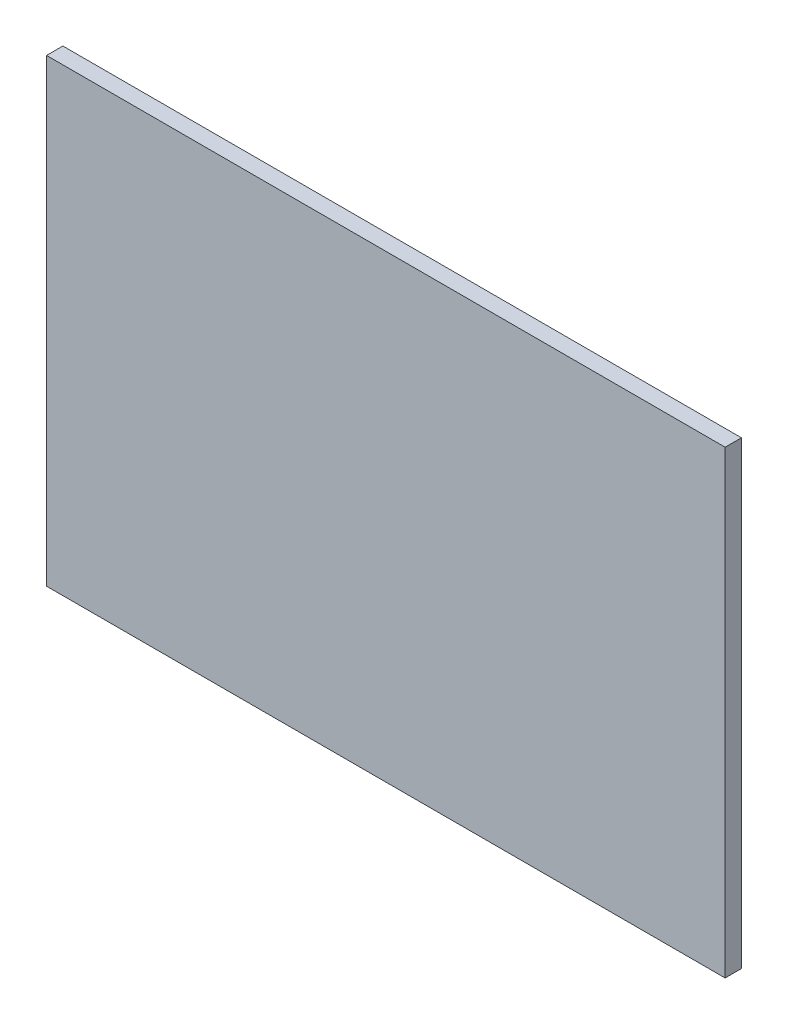
ISO-10303-21;
HEADER;
FILE_DESCRIPTION(('STEP AP214'),'2;1');
FILE_NAME('part.step','',(''),(''),'','','');
FILE_SCHEMA(('AUTOMOTIVE_DESIGN { 1 0 10303 214 1 1 1 1 }'));
ENDSEC;
DATA;
#1=APPLICATION_CONTEXT('core data for automotive mechanical design processes');
#2=APPLICATION_PROTOCOL_DEFINITION('international standard','automotive_design',2000,#1);
#3=PRODUCT_CONTEXT('',#1,'mechanical');
#4=PRODUCT('Part','Part','',(#3));
#5=PRODUCT_RELATED_PRODUCT_CATEGORY('part','',(#4));
#6=PRODUCT_DEFINITION_FORMATION('','',#4);
#7=PRODUCT_DEFINITION_CONTEXT('part definition',#1,'design');
#8=PRODUCT_DEFINITION('design','',#6,#7);
#9=PRODUCT_DEFINITION_SHAPE('','',#8);
#10=(LENGTH_UNIT() NAMED_UNIT(*) SI_UNIT(.MILLI.,.METRE.));
#11=(NAMED_UNIT(*) PLANE_ANGLE_UNIT() SI_UNIT($,.RADIAN.));
#12=(NAMED_UNIT(*) SI_UNIT($,.STERADIAN.) SOLID_ANGLE_UNIT());
#13=UNCERTAINTY_MEASURE_WITH_UNIT(LENGTH_MEASURE(1.E-05),#10,'distance_accuracy_value','');
#14=(GEOMETRIC_REPRESENTATION_CONTEXT(3) GLOBAL_UNCERTAINTY_ASSIGNED_CONTEXT((#13)) GLOBAL_UNIT_ASSIGNED_CONTEXT((#10,
#11,#12)) REPRESENTATION_CONTEXT('',''));
#15=CARTESIAN_POINT('',(0.,0.,0.));
#16=DIRECTION('',(0.,0.,1.));
#17=DIRECTION('',(1.,0.,0.));
#18=AXIS2_PLACEMENT_3D('',#15,#16,#17);
#19=CARTESIAN_POINT('',(0.,0.,2.98));
#20=DIRECTION('',(1.,0.,0.));
#21=DIRECTION('',(0.,1.,0.));
#22=AXIS2_PLACEMENT_3D('',#19,#20,#21);
#23=PLANE('',#22);
#24=DIRECTION('',(0.,-1.,0.));
#25=VECTOR('',#24,1.);
#26=CARTESIAN_POINT('',(0.,0.,0.));
#27=LINE('',#26,#25);
#28=CARTESIAN_POINT('',(0.,0.,0.));
#29=VERTEX_POINT('',#28);
#30=CARTESIAN_POINT('',(0.,-84.,0.));
#31=VERTEX_POINT('',#30);
#32=EDGE_CURVE('E111',#29,#31,#27,.T.);
#33=ORIENTED_EDGE('',*,*,#32,.T.);
#34=DIRECTION('',(0.,0.,-1.));
#35=VECTOR('',#34,1.);
#36=CARTESIAN_POINT('',(0.,-84.,2.98));
#37=LINE('',#36,#35);
#38=CARTESIAN_POINT('',(0.,-84.,2.98));
#39=VERTEX_POINT('',#38);
#40=EDGE_CURVE('E11',#39,#31,#37,.T.);
#41=ORIENTED_EDGE('',*,*,#40,.F.);
#42=DIRECTION('',(0.,-1.,0.));
#43=VECTOR('',#42,1.);
#44=CARTESIAN_POINT('',(0.,0.,2.98));
#45=LINE('',#44,#43);
#46=CARTESIAN_POINT('',(0.,0.,2.98));
#47=VERTEX_POINT('',#46);
#48=EDGE_CURVE('E95',#47,#39,#45,.T.);
#49=ORIENTED_EDGE('',*,*,#48,.F.);
#50=DIRECTION('',(0.,0.,-1.));
#51=VECTOR('',#50,1.);
#52=CARTESIAN_POINT('',(0.,0.,2.98));
#53=LINE('',#52,#51);
#54=EDGE_CURVE('E107',#47,#29,#53,.T.);
#55=ORIENTED_EDGE('',*,*,#54,.T.);
#56=EDGE_LOOP('',(#33,#41,#49,#55));
#57=FACE_BOUND('',#56,.T.);
#58=ADVANCED_FACE('F43',(#57),#23,.F.);
#59=CARTESIAN_POINT('',(0.,-84.,2.98));
#60=DIRECTION('',(0.,1.,0.));
#61=DIRECTION('',(0.,0.,1.));
#62=AXIS2_PLACEMENT_3D('',#59,#60,#61);
#63=PLANE('',#62);
#64=DIRECTION('',(1.,0.,0.));
#65=VECTOR('',#64,1.);
#66=CARTESIAN_POINT('',(0.,-84.,0.));
#67=LINE('',#66,#65);
#68=CARTESIAN_POINT('',(124.,-84.,0.));
#69=VERTEX_POINT('',#68);
#70=EDGE_CURVE('E100',#31,#69,#67,.T.);
#71=ORIENTED_EDGE('',*,*,#70,.T.);
#72=DIRECTION('',(0.,0.,-1.));
#73=VECTOR('',#72,1.);
#74=CARTESIAN_POINT('',(124.,-84.,2.98));
#75=LINE('',#74,#73);
#76=CARTESIAN_POINT('',(124.,-84.,2.98));
#77=VERTEX_POINT('',#76);
#78=EDGE_CURVE('E52',#77,#69,#75,.T.);
#79=ORIENTED_EDGE('',*,*,#78,.F.);
#80=DIRECTION('',(1.,0.,0.));
#81=VECTOR('',#80,1.);
#82=CARTESIAN_POINT('',(0.,-84.,2.98));
#83=LINE('',#82,#81);
#84=EDGE_CURVE('E90',#39,#77,#83,.T.);
#85=ORIENTED_EDGE('',*,*,#84,.F.);
#86=ORIENTED_EDGE('',*,*,#40,.T.);
#87=EDGE_LOOP('',(#71,#79,#85,#86));
#88=FACE_BOUND('',#87,.T.);
#89=ADVANCED_FACE('F99',(#88),#63,.F.);
#90=CARTESIAN_POINT('',(124.,0.,2.98));
#91=DIRECTION('',(-1.,0.,0.));
#92=DIRECTION('',(0.,-1.,0.));
#93=AXIS2_PLACEMENT_3D('',#90,#91,#92);
#94=PLANE('',#93);
#95=DIRECTION('',(0.,1.,0.));
#96=VECTOR('',#95,1.);
#97=CARTESIAN_POINT('',(124.,0.,0.));
#98=LINE('',#97,#96);
#99=CARTESIAN_POINT('',(124.,0.,0.));
#100=VERTEX_POINT('',#99);
#101=EDGE_CURVE('E77',#69,#100,#98,.T.);
#102=ORIENTED_EDGE('',*,*,#101,.T.);
#103=DIRECTION('',(0.,0.,-1.));
#104=VECTOR('',#103,1.);
#105=CARTESIAN_POINT('',(124.,0.,2.98));
#106=LINE('',#105,#104);
#107=CARTESIAN_POINT('',(124.,0.,2.98));
#108=VERTEX_POINT('',#107);
#109=EDGE_CURVE('E102',#108,#100,#106,.T.);
#110=ORIENTED_EDGE('',*,*,#109,.F.);
#111=DIRECTION('',(0.,1.,0.));
#112=VECTOR('',#111,1.);
#113=CARTESIAN_POINT('',(124.,0.,2.98));
#114=LINE('',#113,#112);
#115=EDGE_CURVE('E93',#77,#108,#114,.T.);
#116=ORIENTED_EDGE('',*,*,#115,.F.);
#117=ORIENTED_EDGE('',*,*,#78,.T.);
#118=EDGE_LOOP('',(#102,#110,#116,#117));
#119=FACE_BOUND('',#118,.T.);
#120=ADVANCED_FACE('F103',(#119),#94,.F.);
#121=CARTESIAN_POINT('',(0.,0.,2.98));
#122=DIRECTION('',(0.,-1.,0.));
#123=DIRECTION('',(0.,0.,-1.));
#124=AXIS2_PLACEMENT_3D('',#121,#122,#123);
#125=PLANE('',#124);
#126=DIRECTION('',(-1.,0.,0.));
#127=VECTOR('',#126,1.);
#128=CARTESIAN_POINT('',(0.,0.,0.));
#129=LINE('',#128,#127);
#130=EDGE_CURVE('E83',#100,#29,#129,.T.);
#131=ORIENTED_EDGE('',*,*,#130,.T.);
#132=ORIENTED_EDGE('',*,*,#54,.F.);
#133=DIRECTION('',(-1.,0.,0.));
#134=VECTOR('',#133,1.);
#135=CARTESIAN_POINT('',(0.,0.,2.98));
#136=LINE('',#135,#134);
#137=EDGE_CURVE('E60',#108,#47,#136,.T.);
#138=ORIENTED_EDGE('',*,*,#137,.F.);
#139=ORIENTED_EDGE('',*,*,#109,.T.);
#140=EDGE_LOOP('',(#131,#132,#138,#139));
#141=FACE_BOUND('',#140,.T.);
#142=ADVANCED_FACE('F124',(#141),#125,.F.);
#143=CARTESIAN_POINT('',(0.,0.,2.98));
#144=DIRECTION('',(0.,0.,1.));
#145=DIRECTION('',(1.,0.,0.));
#146=AXIS2_PLACEMENT_3D('',#143,#144,#145);
#147=PLANE('',#146);
#148=ORIENTED_EDGE('',*,*,#48,.T.);
#149=ORIENTED_EDGE('',*,*,#84,.T.);
#150=ORIENTED_EDGE('',*,*,#115,.T.);
#151=ORIENTED_EDGE('',*,*,#137,.T.);
#152=EDGE_LOOP('',(#148,#149,#150,#151));
#153=FACE_BOUND('',#152,.T.);
#154=ADVANCED_FACE('F91',(#153),#147,.T.);
#155=CARTESIAN_POINT('',(0.,0.,0.));
#156=DIRECTION('',(0.,0.,1.));
#157=DIRECTION('',(1.,0.,0.));
#158=AXIS2_PLACEMENT_3D('',#155,#156,#157);
#159=PLANE('',#158);
#160=ORIENTED_EDGE('',*,*,#32,.F.);
#161=ORIENTED_EDGE('',*,*,#130,.F.);
#162=ORIENTED_EDGE('',*,*,#101,.F.);
#163=ORIENTED_EDGE('',*,*,#70,.F.);
#164=EDGE_LOOP('',(#160,#161,#162,#163));
#165=FACE_BOUND('',#164,.T.);
#166=ADVANCED_FACE('F127',(#165),#159,.F.);
#167=CLOSED_SHELL('',(#58,#89,#120,#142,#154,#166));
#168=MANIFOLD_SOLID_BREP('B2',#167);
#169=ADVANCED_BREP_SHAPE_REPRESENTATION('',(#18,#168),#14);
#170=SHAPE_DEFINITION_REPRESENTATION(#9,#169);
ENDSEC;
END-ISO-10303-21;
